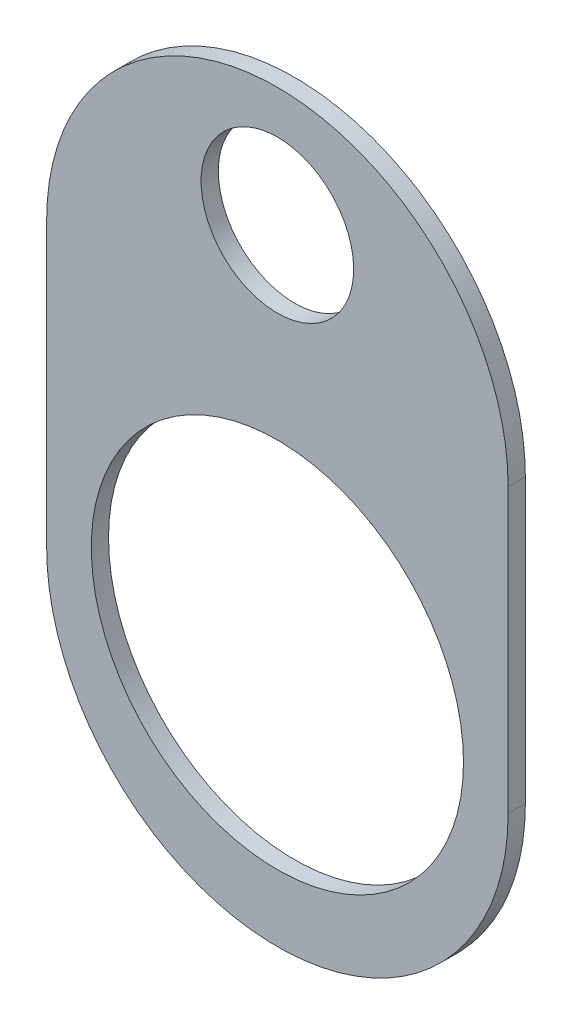
ISO-10303-21;
HEADER;
FILE_DESCRIPTION(('STEP AP214'),'2;1');
FILE_NAME('part.step','',(''),(''),'','','');
FILE_SCHEMA(('AUTOMOTIVE_DESIGN { 1 0 10303 214 1 1 1 1 }'));
ENDSEC;
DATA;
#1=APPLICATION_CONTEXT('core data for automotive mechanical design processes');
#2=APPLICATION_PROTOCOL_DEFINITION('international standard','automotive_design',2000,#1);
#3=PRODUCT_CONTEXT('',#1,'mechanical');
#4=PRODUCT('Part','Part','',(#3));
#5=PRODUCT_RELATED_PRODUCT_CATEGORY('part','',(#4));
#6=PRODUCT_DEFINITION_FORMATION('','',#4);
#7=PRODUCT_DEFINITION_CONTEXT('part definition',#1,'design');
#8=PRODUCT_DEFINITION('design','',#6,#7);
#9=PRODUCT_DEFINITION_SHAPE('','',#8);
#10=(LENGTH_UNIT() NAMED_UNIT(*) SI_UNIT(.MILLI.,.METRE.));
#11=(NAMED_UNIT(*) PLANE_ANGLE_UNIT() SI_UNIT($,.RADIAN.));
#12=(NAMED_UNIT(*) SI_UNIT($,.STERADIAN.) SOLID_ANGLE_UNIT());
#13=UNCERTAINTY_MEASURE_WITH_UNIT(LENGTH_MEASURE(1.E-05),#10,'distance_accuracy_value','');
#14=(GEOMETRIC_REPRESENTATION_CONTEXT(3) GLOBAL_UNCERTAINTY_ASSIGNED_CONTEXT((#13)) GLOBAL_UNIT_ASSIGNED_CONTEXT((#10,
#11,#12)) REPRESENTATION_CONTEXT('',''));
#15=CARTESIAN_POINT('',(0.,0.,0.));
#16=DIRECTION('',(0.,0.,1.));
#17=DIRECTION('',(1.,0.,0.));
#18=AXIS2_PLACEMENT_3D('',#15,#16,#17);
#19=CARTESIAN_POINT('',(15.748,0.,-1.17602));
#20=DIRECTION('',(0.,0.,1.));
#21=DIRECTION('',(1.,0.,0.));
#22=AXIS2_PLACEMENT_3D('',#19,#20,#21);
#23=CYLINDRICAL_SURFACE('',#22,15.748);
#24=CARTESIAN_POINT('',(15.748,0.,0.));
#25=DIRECTION('',(0.,0.,1.));
#26=DIRECTION('',(-1.,0.,0.));
#27=AXIS2_PLACEMENT_3D('',#24,#25,#26);
#28=CIRCLE('',#27,15.748);
#29=CARTESIAN_POINT('',(0.,0.,0.));
#30=VERTEX_POINT('',#29);
#31=CARTESIAN_POINT('',(31.496,0.,0.));
#32=VERTEX_POINT('',#31);
#33=EDGE_CURVE('E102',#30,#32,#28,.T.);
#34=ORIENTED_EDGE('',*,*,#33,.F.);
#35=DIRECTION('',(0.,0.,1.));
#36=VECTOR('',#35,1.);
#37=CARTESIAN_POINT('',(0.,0.,-1.17602));
#38=LINE('',#37,#36);
#39=CARTESIAN_POINT('',(0.,0.,-1.17602));
#40=VERTEX_POINT('',#39);
#41=EDGE_CURVE('E11',#40,#30,#38,.T.);
#42=ORIENTED_EDGE('',*,*,#41,.F.);
#43=CARTESIAN_POINT('',(15.748,0.,-1.17602));
#44=DIRECTION('',(0.,0.,1.));
#45=DIRECTION('',(-1.,0.,0.));
#46=AXIS2_PLACEMENT_3D('',#43,#44,#45);
#47=CIRCLE('',#46,15.748);
#48=CARTESIAN_POINT('',(31.496,0.,-1.17602));
#49=VERTEX_POINT('',#48);
#50=EDGE_CURVE('E100',#40,#49,#47,.T.);
#51=ORIENTED_EDGE('',*,*,#50,.T.);
#52=DIRECTION('',(0.,0.,1.));
#53=VECTOR('',#52,1.);
#54=CARTESIAN_POINT('',(31.496,0.,-1.17602));
#55=LINE('',#54,#53);
#56=EDGE_CURVE('E45',#49,#32,#55,.T.);
#57=ORIENTED_EDGE('',*,*,#56,.T.);
#58=EDGE_LOOP('',(#34,#42,#51,#57));
#59=FACE_BOUND('',#58,.T.);
#60=ADVANCED_FACE('F39',(#59),#23,.T.);
#61=CARTESIAN_POINT('',(0.,0.,-1.17602));
#62=DIRECTION('',(-1.,0.,0.));
#63=DIRECTION('',(0.,0.,1.));
#64=AXIS2_PLACEMENT_3D('',#61,#62,#63);
#65=PLANE('',#64);
#66=DIRECTION('',(0.,-1.,0.));
#67=VECTOR('',#66,1.);
#68=CARTESIAN_POINT('',(0.,0.,0.));
#69=LINE('',#68,#67);
#70=CARTESIAN_POINT('',(0.,19.304,0.));
#71=VERTEX_POINT('',#70);
#72=EDGE_CURVE('E97',#71,#30,#69,.T.);
#73=ORIENTED_EDGE('',*,*,#72,.F.);
#74=DIRECTION('',(0.,0.,1.));
#75=VECTOR('',#74,1.);
#76=CARTESIAN_POINT('',(0.,19.304,-1.17602));
#77=LINE('',#76,#75);
#78=CARTESIAN_POINT('',(0.,19.304,-1.17602));
#79=VERTEX_POINT('',#78);
#80=EDGE_CURVE('E48',#79,#71,#77,.T.);
#81=ORIENTED_EDGE('',*,*,#80,.F.);
#82=DIRECTION('',(0.,-1.,0.));
#83=VECTOR('',#82,1.);
#84=CARTESIAN_POINT('',(0.,0.,-1.17602));
#85=LINE('',#84,#83);
#86=EDGE_CURVE('E94',#79,#40,#85,.T.);
#87=ORIENTED_EDGE('',*,*,#86,.T.);
#88=ORIENTED_EDGE('',*,*,#41,.T.);
#89=EDGE_LOOP('',(#73,#81,#87,#88));
#90=FACE_BOUND('',#89,.T.);
#91=ADVANCED_FACE('F113',(#90),#65,.T.);
#92=CARTESIAN_POINT('',(15.748,19.304,-1.17602));
#93=DIRECTION('',(0.,0.,1.));
#94=DIRECTION('',(1.,0.,0.));
#95=AXIS2_PLACEMENT_3D('',#92,#93,#94);
#96=CYLINDRICAL_SURFACE('',#95,15.748);
#97=CARTESIAN_POINT('',(15.748,19.304,0.));
#98=DIRECTION('',(0.,0.,1.));
#99=DIRECTION('',(-1.,0.,0.));
#100=AXIS2_PLACEMENT_3D('',#97,#98,#99);
#101=CIRCLE('',#100,15.748);
#102=CARTESIAN_POINT('',(31.496,19.304,0.));
#103=VERTEX_POINT('',#102);
#104=EDGE_CURVE('E90',#103,#71,#101,.T.);
#105=ORIENTED_EDGE('',*,*,#104,.F.);
#106=DIRECTION('',(0.,0.,1.));
#107=VECTOR('',#106,1.);
#108=CARTESIAN_POINT('',(31.496,19.304,-1.17602));
#109=LINE('',#108,#107);
#110=CARTESIAN_POINT('',(31.496,19.304,-1.17602));
#111=VERTEX_POINT('',#110);
#112=EDGE_CURVE('E83',#111,#103,#109,.T.);
#113=ORIENTED_EDGE('',*,*,#112,.F.);
#114=CARTESIAN_POINT('',(15.748,19.304,-1.17602));
#115=DIRECTION('',(0.,0.,1.));
#116=DIRECTION('',(-1.,0.,0.));
#117=AXIS2_PLACEMENT_3D('',#114,#115,#116);
#118=CIRCLE('',#117,15.748);
#119=EDGE_CURVE('E87',#111,#79,#118,.T.);
#120=ORIENTED_EDGE('',*,*,#119,.T.);
#121=ORIENTED_EDGE('',*,*,#80,.T.);
#122=EDGE_LOOP('',(#105,#113,#120,#121));
#123=FACE_BOUND('',#122,.T.);
#124=ADVANCED_FACE('F88',(#123),#96,.T.);
#125=CARTESIAN_POINT('',(31.496,0.,-1.17602));
#126=DIRECTION('',(1.,0.,0.));
#127=DIRECTION('',(0.,1.,0.));
#128=AXIS2_PLACEMENT_3D('',#125,#126,#127);
#129=PLANE('',#128);
#130=DIRECTION('',(0.,1.,0.));
#131=VECTOR('',#130,1.);
#132=CARTESIAN_POINT('',(31.496,0.,0.));
#133=LINE('',#132,#131);
#134=EDGE_CURVE('E110',#32,#103,#133,.T.);
#135=ORIENTED_EDGE('',*,*,#134,.F.);
#136=ORIENTED_EDGE('',*,*,#56,.F.);
#137=DIRECTION('',(0.,1.,0.));
#138=VECTOR('',#137,1.);
#139=CARTESIAN_POINT('',(31.496,0.,-1.17602));
#140=LINE('',#139,#138);
#141=EDGE_CURVE('E91',#49,#111,#140,.T.);
#142=ORIENTED_EDGE('',*,*,#141,.T.);
#143=ORIENTED_EDGE('',*,*,#112,.T.);
#144=EDGE_LOOP('',(#135,#136,#142,#143));
#145=FACE_BOUND('',#144,.T.);
#146=ADVANCED_FACE('F96',(#145),#129,.T.);
#147=CARTESIAN_POINT('',(15.748,0.,-1.17602));
#148=DIRECTION('',(0.,0.,-1.));
#149=DIRECTION('',(-1.,0.,0.));
#150=AXIS2_PLACEMENT_3D('',#147,#148,#149);
#151=PLANE('',#150);
#152=CARTESIAN_POINT('',(15.748,26.9021774924567,-1.17602));
#153=DIRECTION('',(0.,0.,-1.));
#154=DIRECTION('',(-1.,0.,0.));
#155=AXIS2_PLACEMENT_3D('',#152,#153,#154);
#156=CIRCLE('',#155,5.207);
#157=CARTESIAN_POINT('',(10.541,26.9021774924567,-1.17602));
#158=VERTEX_POINT('',#157);
#159=EDGE_CURVE('E146',#158,#158,#156,.F.);
#160=ORIENTED_EDGE('',*,*,#159,.T.);
#161=EDGE_LOOP('',(#160));
#162=FACE_BOUND('',#161,.T.);
#163=CARTESIAN_POINT('',(15.748,1.50217749245673,-1.17602));
#164=DIRECTION('',(0.,0.,-1.));
#165=DIRECTION('',(-1.,0.,0.));
#166=AXIS2_PLACEMENT_3D('',#163,#164,#165);
#167=CIRCLE('',#166,12.7);
#168=CARTESIAN_POINT('',(3.048,1.50217749245673,-1.17602));
#169=VERTEX_POINT('',#168);
#170=EDGE_CURVE('E155',#169,#169,#167,.F.);
#171=ORIENTED_EDGE('',*,*,#170,.T.);
#172=EDGE_LOOP('',(#171));
#173=FACE_BOUND('',#172,.T.);
#174=ORIENTED_EDGE('',*,*,#50,.F.);
#175=ORIENTED_EDGE('',*,*,#86,.F.);
#176=ORIENTED_EDGE('',*,*,#119,.F.);
#177=ORIENTED_EDGE('',*,*,#141,.F.);
#178=EDGE_LOOP('',(#174,#175,#176,#177));
#179=FACE_BOUND('',#178,.T.);
#180=ADVANCED_FACE('F95',(#162,#173,#179),#151,.T.);
#181=CARTESIAN_POINT('',(15.748,0.,0.));
#182=DIRECTION('',(0.,0.,-1.));
#183=DIRECTION('',(-1.,0.,0.));
#184=AXIS2_PLACEMENT_3D('',#181,#182,#183);
#185=PLANE('',#184);
#186=CARTESIAN_POINT('',(15.748,26.9021774924567,0.));
#187=DIRECTION('',(0.,0.,1.));
#188=DIRECTION('',(1.,0.,0.));
#189=AXIS2_PLACEMENT_3D('',#186,#187,#188);
#190=CIRCLE('',#189,5.207);
#191=CARTESIAN_POINT('',(20.955,26.9021774924567,0.));
#192=VERTEX_POINT('',#191);
#193=EDGE_CURVE('E107',#192,#192,#190,.T.);
#194=ORIENTED_EDGE('',*,*,#193,.F.);
#195=EDGE_LOOP('',(#194));
#196=FACE_BOUND('',#195,.T.);
#197=CARTESIAN_POINT('',(15.748,1.50217749245673,0.));
#198=DIRECTION('',(0.,0.,1.));
#199=DIRECTION('',(1.,0.,0.));
#200=AXIS2_PLACEMENT_3D('',#197,#198,#199);
#201=CIRCLE('',#200,12.7);
#202=CARTESIAN_POINT('',(28.448,1.50217749245673,0.));
#203=VERTEX_POINT('',#202);
#204=EDGE_CURVE('E156',#203,#203,#201,.T.);
#205=ORIENTED_EDGE('',*,*,#204,.F.);
#206=EDGE_LOOP('',(#205));
#207=FACE_BOUND('',#206,.T.);
#208=ORIENTED_EDGE('',*,*,#33,.T.);
#209=ORIENTED_EDGE('',*,*,#134,.T.);
#210=ORIENTED_EDGE('',*,*,#104,.T.);
#211=ORIENTED_EDGE('',*,*,#72,.T.);
#212=EDGE_LOOP('',(#208,#209,#210,#211));
#213=FACE_BOUND('',#212,.T.);
#214=ADVANCED_FACE('F111',(#196,#207,#213),#185,.F.);
#215=CARTESIAN_POINT('',(15.748,1.50217749245673,-1.17702));
#216=DIRECTION('',(0.,0.,1.));
#217=DIRECTION('',(1.,0.,0.));
#218=AXIS2_PLACEMENT_3D('',#215,#216,#217);
#219=CYLINDRICAL_SURFACE('',#218,12.7);
#220=ORIENTED_EDGE('',*,*,#170,.F.);
#221=EDGE_LOOP('',(#220));
#222=FACE_BOUND('',#221,.T.);
#223=ORIENTED_EDGE('',*,*,#204,.T.);
#224=EDGE_LOOP('',(#223));
#225=FACE_BOUND('',#224,.T.);
#226=ADVANCED_FACE('F134',(#222,#225),#219,.F.);
#227=CARTESIAN_POINT('',(15.748,26.9021774924567,-1.17702));
#228=DIRECTION('',(0.,0.,1.));
#229=DIRECTION('',(1.,0.,0.));
#230=AXIS2_PLACEMENT_3D('',#227,#228,#229);
#231=CYLINDRICAL_SURFACE('',#230,5.207);
#232=ORIENTED_EDGE('',*,*,#159,.F.);
#233=EDGE_LOOP('',(#232));
#234=FACE_BOUND('',#233,.T.);
#235=ORIENTED_EDGE('',*,*,#193,.T.);
#236=EDGE_LOOP('',(#235));
#237=FACE_BOUND('',#236,.T.);
#238=ADVANCED_FACE('F137',(#234,#237),#231,.F.);
#239=CLOSED_SHELL('',(#60,#91,#124,#146,#180,#214,#226,#238));
#240=MANIFOLD_SOLID_BREP('B2',#239);
#241=ADVANCED_BREP_SHAPE_REPRESENTATION('',(#18,#240),#14);
#242=SHAPE_DEFINITION_REPRESENTATION(#9,#241);
ENDSEC;
END-ISO-10303-21;
